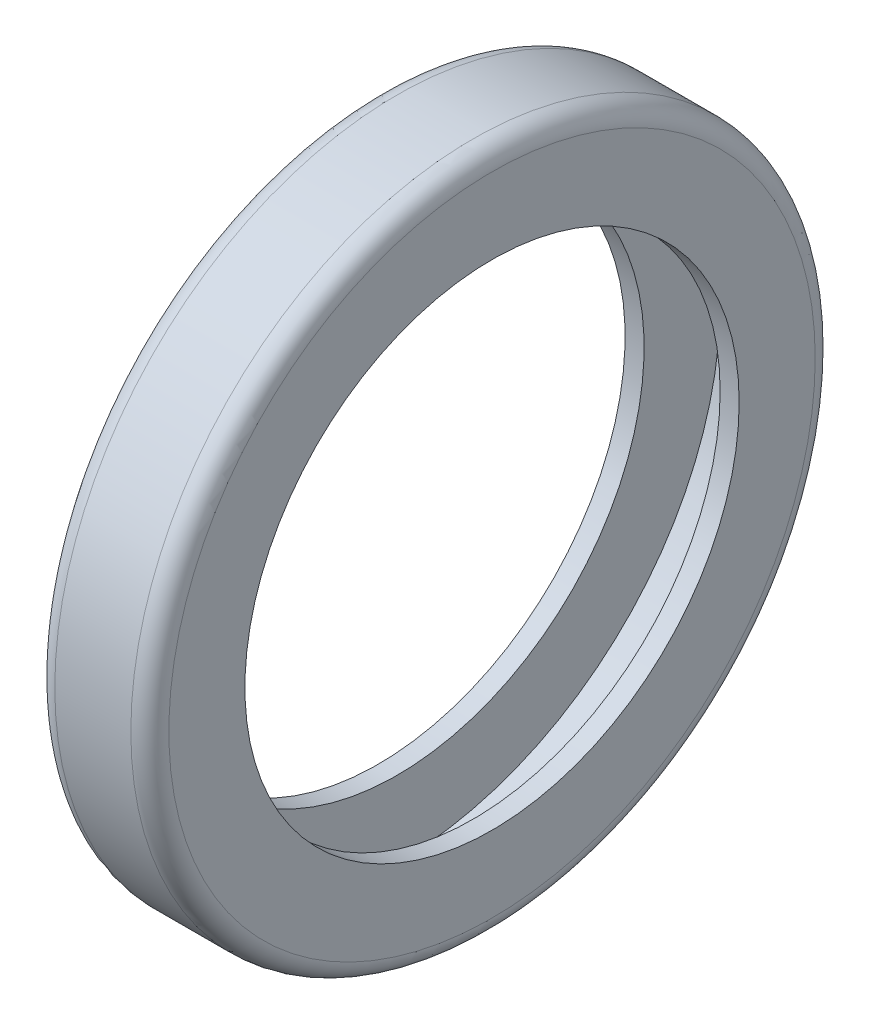
ISO-10303-21;
HEADER;
FILE_DESCRIPTION(('STEP AP214'),'2;1');
FILE_NAME('part.step','',(''),(''),'','','');
FILE_SCHEMA(('AUTOMOTIVE_DESIGN { 1 0 10303 214 1 1 1 1 }'));
ENDSEC;
DATA;
#1=APPLICATION_CONTEXT('core data for automotive mechanical design processes');
#2=APPLICATION_PROTOCOL_DEFINITION('international standard','automotive_design',2000,#1);
#3=PRODUCT_CONTEXT('',#1,'mechanical');
#4=PRODUCT('Part','Part','',(#3));
#5=PRODUCT_RELATED_PRODUCT_CATEGORY('part','',(#4));
#6=PRODUCT_DEFINITION_FORMATION('','',#4);
#7=PRODUCT_DEFINITION_CONTEXT('part definition',#1,'design');
#8=PRODUCT_DEFINITION('design','',#6,#7);
#9=PRODUCT_DEFINITION_SHAPE('','',#8);
#10=(LENGTH_UNIT() NAMED_UNIT(*) SI_UNIT(.MILLI.,.METRE.));
#11=(NAMED_UNIT(*) PLANE_ANGLE_UNIT() SI_UNIT($,.RADIAN.));
#12=(NAMED_UNIT(*) SI_UNIT($,.STERADIAN.) SOLID_ANGLE_UNIT());
#13=UNCERTAINTY_MEASURE_WITH_UNIT(LENGTH_MEASURE(1.E-05),#10,'distance_accuracy_value','');
#14=(GEOMETRIC_REPRESENTATION_CONTEXT(3) GLOBAL_UNCERTAINTY_ASSIGNED_CONTEXT((#13)) GLOBAL_UNIT_ASSIGNED_CONTEXT((#10,
#11,#12)) REPRESENTATION_CONTEXT('',''));
#15=CARTESIAN_POINT('',(0.,0.,0.));
#16=DIRECTION('',(0.,0.,1.));
#17=DIRECTION('',(1.,0.,0.));
#18=AXIS2_PLACEMENT_3D('',#15,#16,#17);
#19=CARTESIAN_POINT('',(7.2,0.,0.));
#20=DIRECTION('',(-1.,0.,0.));
#21=DIRECTION('',(0.,0.,1.));
#22=AXIS2_PLACEMENT_3D('',#19,#20,#21);
#23=CYLINDRICAL_SURFACE('',#22,20.4);
#24=CARTESIAN_POINT('',(6.,0.,0.));
#25=DIRECTION('',(1.,0.,0.));
#26=DIRECTION('',(0.,0.,-1.));
#27=AXIS2_PLACEMENT_3D('',#24,#25,#26);
#28=CIRCLE('',#27,20.4);
#29=CARTESIAN_POINT('',(6.,0.,-20.4));
#30=VERTEX_POINT('',#29);
#31=EDGE_CURVE('E61',#30,#30,#28,.T.);
#32=ORIENTED_EDGE('',*,*,#31,.T.);
#33=EDGE_LOOP('',(#32));
#34=FACE_BOUND('',#33,.T.);
#35=CARTESIAN_POINT('',(1.2,0.,0.));
#36=DIRECTION('',(-1.,0.,0.));
#37=DIRECTION('',(0.,0.,1.));
#38=AXIS2_PLACEMENT_3D('',#35,#36,#37);
#39=CIRCLE('',#38,20.4);
#40=CARTESIAN_POINT('',(1.2,0.,20.4));
#41=VERTEX_POINT('',#40);
#42=EDGE_CURVE('E68',#41,#41,#39,.T.);
#43=ORIENTED_EDGE('',*,*,#42,.T.);
#44=EDGE_LOOP('',(#43));
#45=FACE_BOUND('',#44,.T.);
#46=ADVANCED_FACE('F41',(#34,#45),#23,.F.);
#47=CARTESIAN_POINT('',(7.2,0.,0.));
#48=DIRECTION('',(1.,0.,0.));
#49=DIRECTION('',(0.,0.,-1.));
#50=AXIS2_PLACEMENT_3D('',#47,#48,#49);
#51=PLANE('',#50);
#52=CARTESIAN_POINT('',(7.2,0.,0.));
#53=DIRECTION('',(1.,0.,0.));
#54=DIRECTION('',(0.,0.,-1.));
#55=AXIS2_PLACEMENT_3D('',#52,#53,#54);
#56=CIRCLE('',#55,20.4);
#57=CARTESIAN_POINT('',(7.2,0.,-20.4));
#58=VERTEX_POINT('',#57);
#59=EDGE_CURVE('E11',#58,#58,#56,.T.);
#60=ORIENTED_EDGE('',*,*,#59,.T.);
#61=EDGE_LOOP('',(#60));
#62=FACE_BOUND('',#61,.T.);
#63=CARTESIAN_POINT('',(7.2,0.,0.));
#64=DIRECTION('',(1.,0.,0.));
#65=DIRECTION('',(0.,0.,-1.));
#66=AXIS2_PLACEMENT_3D('',#63,#64,#65);
#67=CIRCLE('',#66,15.6);
#68=CARTESIAN_POINT('',(7.2,0.,-15.6));
#69=VERTEX_POINT('',#68);
#70=EDGE_CURVE('E65',#69,#69,#67,.T.);
#71=ORIENTED_EDGE('',*,*,#70,.F.);
#72=EDGE_LOOP('',(#71));
#73=FACE_BOUND('',#72,.T.);
#74=ADVANCED_FACE('F93',(#62,#73),#51,.T.);
#75=CARTESIAN_POINT('',(0.,0.,0.));
#76=DIRECTION('',(1.,0.,0.));
#77=DIRECTION('',(0.,0.,-1.));
#78=AXIS2_PLACEMENT_3D('',#75,#76,#77);
#79=PLANE('',#78);
#80=CARTESIAN_POINT('',(0.,0.,0.));
#81=DIRECTION('',(1.,0.,0.));
#82=DIRECTION('',(0.,0.,-1.));
#83=AXIS2_PLACEMENT_3D('',#80,#81,#82);
#84=CIRCLE('',#83,20.4);
#85=CARTESIAN_POINT('',(0.,0.,-20.4));
#86=VERTEX_POINT('',#85);
#87=EDGE_CURVE('E48',#86,#86,#84,.F.);
#88=ORIENTED_EDGE('',*,*,#87,.T.);
#89=EDGE_LOOP('',(#88));
#90=FACE_BOUND('',#89,.T.);
#91=CARTESIAN_POINT('',(0.,0.,0.));
#92=DIRECTION('',(-1.,0.,0.));
#93=DIRECTION('',(0.,0.,1.));
#94=AXIS2_PLACEMENT_3D('',#91,#92,#93);
#95=CIRCLE('',#94,15.6);
#96=CARTESIAN_POINT('',(0.,0.,15.6));
#97=VERTEX_POINT('',#96);
#98=EDGE_CURVE('E74',#97,#97,#95,.T.);
#99=ORIENTED_EDGE('',*,*,#98,.F.);
#100=EDGE_LOOP('',(#99));
#101=FACE_BOUND('',#100,.T.);
#102=ADVANCED_FACE('F90',(#90,#101),#79,.F.);
#103=CARTESIAN_POINT('',(7.2,0.,0.));
#104=DIRECTION('',(-1.,0.,0.));
#105=DIRECTION('',(0.,0.,1.));
#106=AXIS2_PLACEMENT_3D('',#103,#104,#105);
#107=CYLINDRICAL_SURFACE('',#106,21.6);
#108=CARTESIAN_POINT('',(1.2,0.,0.));
#109=DIRECTION('',(1.,0.,0.));
#110=DIRECTION('',(0.,0.,-1.));
#111=AXIS2_PLACEMENT_3D('',#108,#109,#110);
#112=CIRCLE('',#111,21.6);
#113=CARTESIAN_POINT('',(1.2,0.,-21.6));
#114=VERTEX_POINT('',#113);
#115=EDGE_CURVE('E52',#114,#114,#112,.T.);
#116=ORIENTED_EDGE('',*,*,#115,.T.);
#117=EDGE_LOOP('',(#116));
#118=FACE_BOUND('',#117,.T.);
#119=CARTESIAN_POINT('',(6.,0.,0.));
#120=DIRECTION('',(1.,0.,0.));
#121=DIRECTION('',(0.,0.,-1.));
#122=AXIS2_PLACEMENT_3D('',#119,#120,#121);
#123=CIRCLE('',#122,21.6);
#124=CARTESIAN_POINT('',(6.,0.,-21.6));
#125=VERTEX_POINT('',#124);
#126=EDGE_CURVE('E56',#125,#125,#123,.F.);
#127=ORIENTED_EDGE('',*,*,#126,.T.);
#128=EDGE_LOOP('',(#127));
#129=FACE_BOUND('',#128,.T.);
#130=ADVANCED_FACE('F92',(#118,#129),#107,.T.);
#131=CARTESIAN_POINT('',(6.,0.,0.));
#132=DIRECTION('',(1.,0.,0.));
#133=DIRECTION('',(0.,0.,-1.));
#134=AXIS2_PLACEMENT_3D('',#131,#132,#133);
#135=PLANE('',#134);
#136=CARTESIAN_POINT('',(6.,0.,0.));
#137=DIRECTION('',(1.,0.,0.));
#138=DIRECTION('',(0.,0.,-1.));
#139=AXIS2_PLACEMENT_3D('',#136,#137,#138);
#140=CIRCLE('',#139,15.6);
#141=CARTESIAN_POINT('',(6.,0.,-15.6));
#142=VERTEX_POINT('',#141);
#143=EDGE_CURVE('E64',#142,#142,#140,.T.);
#144=ORIENTED_EDGE('',*,*,#143,.T.);
#145=EDGE_LOOP('',(#144));
#146=FACE_BOUND('',#145,.T.);
#147=ORIENTED_EDGE('',*,*,#31,.F.);
#148=EDGE_LOOP('',(#147));
#149=FACE_BOUND('',#148,.T.);
#150=ADVANCED_FACE('F99',(#146,#149),#135,.F.);
#151=CARTESIAN_POINT('',(6.,0.,0.));
#152=DIRECTION('',(1.,0.,0.));
#153=DIRECTION('',(0.,0.,-1.));
#154=AXIS2_PLACEMENT_3D('',#151,#152,#153);
#155=CYLINDRICAL_SURFACE('',#154,15.6);
#156=ORIENTED_EDGE('',*,*,#143,.F.);
#157=EDGE_LOOP('',(#156));
#158=FACE_BOUND('',#157,.T.);
#159=ORIENTED_EDGE('',*,*,#70,.T.);
#160=EDGE_LOOP('',(#159));
#161=FACE_BOUND('',#160,.T.);
#162=ADVANCED_FACE('F112',(#158,#161),#155,.F.);
#163=CARTESIAN_POINT('',(1.2,0.,0.));
#164=DIRECTION('',(-1.,0.,0.));
#165=DIRECTION('',(0.,0.,1.));
#166=AXIS2_PLACEMENT_3D('',#163,#164,#165);
#167=PLANE('',#166);
#168=CARTESIAN_POINT('',(1.2,0.,0.));
#169=DIRECTION('',(-1.,0.,0.));
#170=DIRECTION('',(0.,0.,1.));
#171=AXIS2_PLACEMENT_3D('',#168,#169,#170);
#172=CIRCLE('',#171,15.6);
#173=CARTESIAN_POINT('',(1.2,0.,15.6));
#174=VERTEX_POINT('',#173);
#175=EDGE_CURVE('E73',#174,#174,#172,.T.);
#176=ORIENTED_EDGE('',*,*,#175,.T.);
#177=EDGE_LOOP('',(#176));
#178=FACE_BOUND('',#177,.T.);
#179=ORIENTED_EDGE('',*,*,#42,.F.);
#180=EDGE_LOOP('',(#179));
#181=FACE_BOUND('',#180,.T.);
#182=ADVANCED_FACE('F80',(#178,#181),#167,.F.);
#183=CARTESIAN_POINT('',(1.2,0.,0.));
#184=DIRECTION('',(-1.,0.,0.));
#185=DIRECTION('',(0.,0.,1.));
#186=AXIS2_PLACEMENT_3D('',#183,#184,#185);
#187=CYLINDRICAL_SURFACE('',#186,15.6);
#188=ORIENTED_EDGE('',*,*,#175,.F.);
#189=EDGE_LOOP('',(#188));
#190=FACE_BOUND('',#189,.T.);
#191=ORIENTED_EDGE('',*,*,#98,.T.);
#192=EDGE_LOOP('',(#191));
#193=FACE_BOUND('',#192,.T.);
#194=ADVANCED_FACE('F83',(#190,#193),#187,.F.);
#195=CARTESIAN_POINT('',(1.2,0.,0.));
#196=DIRECTION('',(1.,0.,0.));
#197=DIRECTION('',(0.,0.,-1.));
#198=AXIS2_PLACEMENT_3D('',#195,#196,#197);
#199=TOROIDAL_SURFACE('',#198,20.4,1.2);
#200=ORIENTED_EDGE('',*,*,#87,.F.);
#201=EDGE_LOOP('',(#200));
#202=FACE_BOUND('',#201,.T.);
#203=ORIENTED_EDGE('',*,*,#115,.F.);
#204=EDGE_LOOP('',(#203));
#205=FACE_BOUND('',#204,.T.);
#206=ADVANCED_FACE('F86',(#202,#205),#199,.T.);
#207=CARTESIAN_POINT('',(6.,0.,0.));
#208=DIRECTION('',(1.,0.,0.));
#209=DIRECTION('',(0.,0.,-1.));
#210=AXIS2_PLACEMENT_3D('',#207,#208,#209);
#211=TOROIDAL_SURFACE('',#210,20.4,1.2);
#212=ORIENTED_EDGE('',*,*,#126,.F.);
#213=EDGE_LOOP('',(#212));
#214=FACE_BOUND('',#213,.T.);
#215=ORIENTED_EDGE('',*,*,#59,.F.);
#216=EDGE_LOOP('',(#215));
#217=FACE_BOUND('',#216,.T.);
#218=ADVANCED_FACE('F43',(#214,#217),#211,.T.);
#219=CLOSED_SHELL('',(#46,#74,#102,#130,#150,#162,#182,#194,#206,#218));
#220=MANIFOLD_SOLID_BREP('B2',#219);
#221=ADVANCED_BREP_SHAPE_REPRESENTATION('',(#18,#220),#14);
#222=SHAPE_DEFINITION_REPRESENTATION(#9,#221);
ENDSEC;
END-ISO-10303-21;
